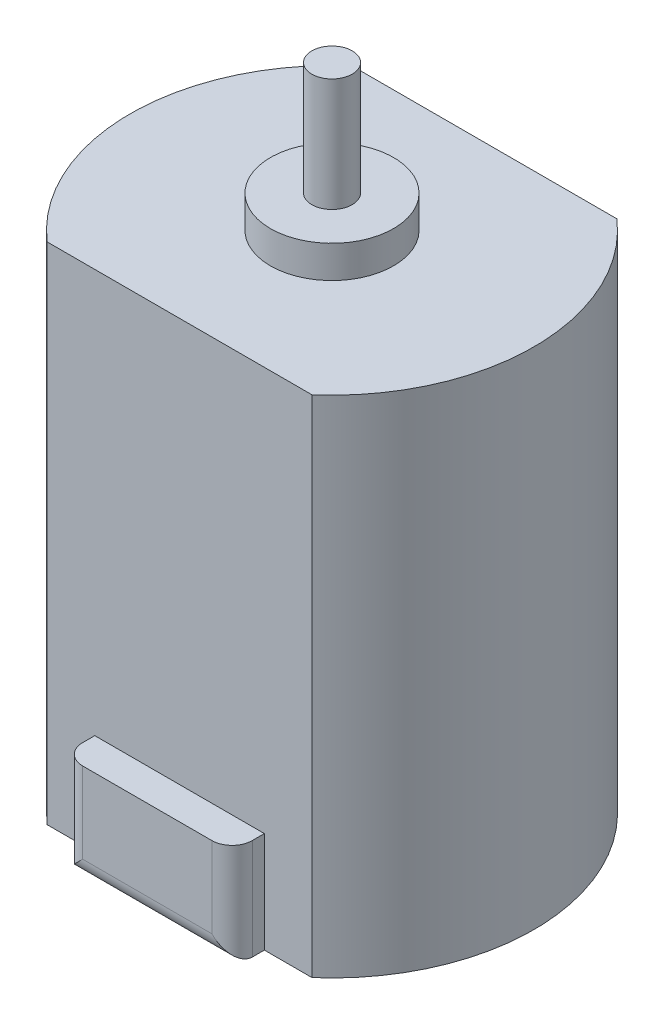
ISO-10303-21;
HEADER;
FILE_DESCRIPTION(('STEP AP214'),'2;1');
FILE_NAME('part.step','',(''),(''),'','','');
FILE_SCHEMA(('AUTOMOTIVE_DESIGN { 1 0 10303 214 1 1 1 1 }'));
ENDSEC;
DATA;
#1=APPLICATION_CONTEXT('core data for automotive mechanical design processes');
#2=APPLICATION_PROTOCOL_DEFINITION('international standard','automotive_design',2000,#1);
#3=PRODUCT_CONTEXT('',#1,'mechanical');
#4=PRODUCT('Part','Part','',(#3));
#5=PRODUCT_RELATED_PRODUCT_CATEGORY('part','',(#4));
#6=PRODUCT_DEFINITION_FORMATION('','',#4);
#7=PRODUCT_DEFINITION_CONTEXT('part definition',#1,'design');
#8=PRODUCT_DEFINITION('design','',#6,#7);
#9=PRODUCT_DEFINITION_SHAPE('','',#8);
#10=(LENGTH_UNIT() NAMED_UNIT(*) SI_UNIT(.MILLI.,.METRE.));
#11=(NAMED_UNIT(*) PLANE_ANGLE_UNIT() SI_UNIT($,.RADIAN.));
#12=(NAMED_UNIT(*) SI_UNIT($,.STERADIAN.) SOLID_ANGLE_UNIT());
#13=UNCERTAINTY_MEASURE_WITH_UNIT(LENGTH_MEASURE(1.E-05),#10,'distance_accuracy_value','');
#14=(GEOMETRIC_REPRESENTATION_CONTEXT(3) GLOBAL_UNCERTAINTY_ASSIGNED_CONTEXT((#13)) GLOBAL_UNIT_ASSIGNED_CONTEXT((#10,
#11,#12)) REPRESENTATION_CONTEXT('',''));
#15=CARTESIAN_POINT('',(0.,0.,0.));
#16=DIRECTION('',(0.,0.,1.));
#17=DIRECTION('',(1.,0.,0.));
#18=AXIS2_PLACEMENT_3D('',#15,#16,#17);
#19=CARTESIAN_POINT('',(0.,25.,7.55));
#20=DIRECTION('',(0.,0.,-1.));
#21=DIRECTION('',(-1.,0.,0.));
#22=AXIS2_PLACEMENT_3D('',#19,#20,#21);
#23=PLANE('',#22);
#24=DIRECTION('',(0.,-1.,0.));
#25=VECTOR('',#24,1.);
#26=CARTESIAN_POINT('',(-4.2,5.,7.55));
#27=LINE('',#26,#25);
#28=CARTESIAN_POINT('',(-4.2,5.,7.55));
#29=VERTEX_POINT('',#28);
#30=CARTESIAN_POINT('',(-4.2,0.,7.55));
#31=VERTEX_POINT('',#30);
#32=EDGE_CURVE('E133',#29,#31,#27,.T.);
#33=ORIENTED_EDGE('',*,*,#32,.F.);
#34=DIRECTION('',(-1.,0.,0.));
#35=VECTOR('',#34,1.);
#36=CARTESIAN_POINT('',(-4.2,5.,7.55));
#37=LINE('',#36,#35);
#38=CARTESIAN_POINT('',(4.2,5.,7.55));
#39=VERTEX_POINT('',#38);
#40=EDGE_CURVE('E121',#39,#29,#37,.T.);
#41=ORIENTED_EDGE('',*,*,#40,.F.);
#42=DIRECTION('',(0.,1.,0.));
#43=VECTOR('',#42,1.);
#44=CARTESIAN_POINT('',(4.2,5.,7.55));
#45=LINE('',#44,#43);
#46=CARTESIAN_POINT('',(4.2,0.,7.55));
#47=VERTEX_POINT('',#46);
#48=EDGE_CURVE('E129',#47,#39,#45,.T.);
#49=ORIENTED_EDGE('',*,*,#48,.F.);
#50=DIRECTION('',(1.,0.,0.));
#51=VECTOR('',#50,1.);
#52=CARTESIAN_POINT('',(0.,0.,7.55));
#53=LINE('',#52,#51);
#54=CARTESIAN_POINT('',(6.55724789831832,0.,7.55));
#55=VERTEX_POINT('',#54);
#56=EDGE_CURVE('E168',#47,#55,#53,.T.);
#57=ORIENTED_EDGE('',*,*,#56,.T.);
#58=DIRECTION('',(0.,-1.,0.));
#59=VECTOR('',#58,1.);
#60=CARTESIAN_POINT('',(6.55724789831832,25.,7.55));
#61=LINE('',#60,#59);
#62=CARTESIAN_POINT('',(6.55724789831832,25.,7.55));
#63=VERTEX_POINT('',#62);
#64=EDGE_CURVE('E171',#63,#55,#61,.T.);
#65=ORIENTED_EDGE('',*,*,#64,.F.);
#66=DIRECTION('',(1.,0.,0.));
#67=VECTOR('',#66,1.);
#68=CARTESIAN_POINT('',(0.,25.,7.55));
#69=LINE('',#68,#67);
#70=CARTESIAN_POINT('',(-6.55724789831832,25.,7.55));
#71=VERTEX_POINT('',#70);
#72=EDGE_CURVE('E172',#71,#63,#69,.T.);
#73=ORIENTED_EDGE('',*,*,#72,.F.);
#74=DIRECTION('',(0.,-1.,0.));
#75=VECTOR('',#74,1.);
#76=CARTESIAN_POINT('',(-6.55724789831832,25.,7.55));
#77=LINE('',#76,#75);
#78=CARTESIAN_POINT('',(-6.55724789831832,0.,7.55));
#79=VERTEX_POINT('',#78);
#80=EDGE_CURVE('E190',#71,#79,#77,.T.);
#81=ORIENTED_EDGE('',*,*,#80,.T.);
#82=EDGE_CURVE('E182',#79,#31,#53,.T.);
#83=ORIENTED_EDGE('',*,*,#82,.T.);
#84=EDGE_LOOP('',(#33,#41,#49,#57,#65,#73,#81,#83));
#85=FACE_BOUND('',#84,.T.);
#86=ADVANCED_FACE('F41',(#85),#23,.F.);
#87=CARTESIAN_POINT('',(0.,25.,0.));
#88=DIRECTION('',(0.,-1.,0.));
#89=DIRECTION('',(0.,0.,-1.));
#90=AXIS2_PLACEMENT_3D('',#87,#88,#89);
#91=CYLINDRICAL_SURFACE('',#90,10.);
#92=CARTESIAN_POINT('',(0.,0.,0.));
#93=DIRECTION('',(0.,1.,0.));
#94=DIRECTION('',(0.,0.,1.));
#95=AXIS2_PLACEMENT_3D('',#92,#93,#94);
#96=CIRCLE('',#95,10.);
#97=CARTESIAN_POINT('',(6.55724789831832,0.,-7.55));
#98=VERTEX_POINT('',#97);
#99=EDGE_CURVE('E184',#55,#98,#96,.T.);
#100=ORIENTED_EDGE('',*,*,#99,.T.);
#101=DIRECTION('',(0.,-1.,0.));
#102=VECTOR('',#101,1.);
#103=CARTESIAN_POINT('',(6.55724789831832,25.,-7.55));
#104=LINE('',#103,#102);
#105=CARTESIAN_POINT('',(6.55724789831832,25.,-7.55));
#106=VERTEX_POINT('',#105);
#107=EDGE_CURVE('E195',#106,#98,#104,.T.);
#108=ORIENTED_EDGE('',*,*,#107,.F.);
#109=CARTESIAN_POINT('',(0.,25.,0.));
#110=DIRECTION('',(0.,1.,0.));
#111=DIRECTION('',(0.,0.,1.));
#112=AXIS2_PLACEMENT_3D('',#109,#110,#111);
#113=CIRCLE('',#112,10.);
#114=EDGE_CURVE('E175',#63,#106,#113,.T.);
#115=ORIENTED_EDGE('',*,*,#114,.F.);
#116=ORIENTED_EDGE('',*,*,#64,.T.);
#117=EDGE_LOOP('',(#100,#108,#115,#116));
#118=FACE_BOUND('',#117,.T.);
#119=ADVANCED_FACE('F248',(#118),#91,.T.);
#120=CARTESIAN_POINT('',(0.,25.,-7.55));
#121=DIRECTION('',(0.,0.,-1.));
#122=DIRECTION('',(-1.,0.,0.));
#123=AXIS2_PLACEMENT_3D('',#120,#121,#122);
#124=PLANE('',#123);
#125=DIRECTION('',(1.,0.,0.));
#126=VECTOR('',#125,1.);
#127=CARTESIAN_POINT('',(0.,0.,-7.55));
#128=LINE('',#127,#126);
#129=CARTESIAN_POINT('',(-6.55724789831832,0.,-7.55));
#130=VERTEX_POINT('',#129);
#131=EDGE_CURVE('E187',#130,#98,#128,.T.);
#132=ORIENTED_EDGE('',*,*,#131,.F.);
#133=DIRECTION('',(0.,-1.,0.));
#134=VECTOR('',#133,1.);
#135=CARTESIAN_POINT('',(-6.55724789831832,25.,-7.55));
#136=LINE('',#135,#134);
#137=CARTESIAN_POINT('',(-6.55724789831832,25.,-7.55));
#138=VERTEX_POINT('',#137);
#139=EDGE_CURVE('E193',#138,#130,#136,.T.);
#140=ORIENTED_EDGE('',*,*,#139,.F.);
#141=DIRECTION('',(1.,0.,0.));
#142=VECTOR('',#141,1.);
#143=CARTESIAN_POINT('',(0.,25.,-7.55));
#144=LINE('',#143,#142);
#145=EDGE_CURVE('E178',#138,#106,#144,.T.);
#146=ORIENTED_EDGE('',*,*,#145,.T.);
#147=ORIENTED_EDGE('',*,*,#107,.T.);
#148=EDGE_LOOP('',(#132,#140,#146,#147));
#149=FACE_BOUND('',#148,.T.);
#150=ADVANCED_FACE('F245',(#149),#124,.T.);
#151=EDGE_CURVE('E176',#130,#79,#96,.T.);
#152=ORIENTED_EDGE('',*,*,#151,.T.);
#153=ORIENTED_EDGE('',*,*,#80,.F.);
#154=EDGE_CURVE('E179',#138,#71,#113,.T.);
#155=ORIENTED_EDGE('',*,*,#154,.F.);
#156=ORIENTED_EDGE('',*,*,#139,.T.);
#157=EDGE_LOOP('',(#152,#153,#155,#156));
#158=FACE_BOUND('',#157,.T.);
#159=ADVANCED_FACE('F240',(#158),#91,.T.);
#160=CARTESIAN_POINT('',(0.,25.,0.));
#161=DIRECTION('',(0.,1.,0.));
#162=DIRECTION('',(0.,0.,1.));
#163=AXIS2_PLACEMENT_3D('',#160,#161,#162);
#164=PLANE('',#163);
#165=CARTESIAN_POINT('',(0.,25.,0.));
#166=DIRECTION('',(0.,1.,0.));
#167=DIRECTION('',(0.,0.,1.));
#168=AXIS2_PLACEMENT_3D('',#165,#166,#167);
#169=CIRCLE('',#168,3.05);
#170=CARTESIAN_POINT('',(0.,25.,3.05));
#171=VERTEX_POINT('',#170);
#172=EDGE_CURVE('E165',#171,#171,#169,.T.);
#173=ORIENTED_EDGE('',*,*,#172,.F.);
#174=EDGE_LOOP('',(#173));
#175=FACE_BOUND('',#174,.T.);
#176=ORIENTED_EDGE('',*,*,#72,.T.);
#177=ORIENTED_EDGE('',*,*,#114,.T.);
#178=ORIENTED_EDGE('',*,*,#145,.F.);
#179=ORIENTED_EDGE('',*,*,#154,.T.);
#180=EDGE_LOOP('',(#176,#177,#178,#179));
#181=FACE_BOUND('',#180,.T.);
#182=ADVANCED_FACE('F250',(#175,#181),#164,.T.);
#183=CARTESIAN_POINT('',(0.,0.,0.));
#184=DIRECTION('',(0.,1.,0.));
#185=DIRECTION('',(0.,0.,1.));
#186=AXIS2_PLACEMENT_3D('',#183,#184,#185);
#187=PLANE('',#186);
#188=CARTESIAN_POINT('',(0.,0.,0.));
#189=DIRECTION('',(0.,-1.,0.));
#190=DIRECTION('',(0.,0.,-1.));
#191=AXIS2_PLACEMENT_3D('',#188,#189,#190);
#192=CIRCLE('',#191,4.95);
#193=CARTESIAN_POINT('',(0.,0.,-4.95));
#194=VERTEX_POINT('',#193);
#195=EDGE_CURVE('E153',#194,#194,#192,.T.);
#196=ORIENTED_EDGE('',*,*,#195,.F.);
#197=EDGE_LOOP('',(#196));
#198=FACE_BOUND('',#197,.T.);
#199=DIRECTION('',(0.,0.,-1.));
#200=VECTOR('',#199,1.);
#201=CARTESIAN_POINT('',(4.2,0.,9.15));
#202=LINE('',#201,#200);
#203=CARTESIAN_POINT('',(4.2,0.,8.15));
#204=VERTEX_POINT('',#203);
#205=EDGE_CURVE('E123',#204,#47,#202,.T.);
#206=ORIENTED_EDGE('',*,*,#205,.F.);
#207=DIRECTION('',(1.,0.,0.));
#208=VECTOR('',#207,1.);
#209=CARTESIAN_POINT('',(-4.2,0.,8.15));
#210=LINE('',#209,#208);
#211=CARTESIAN_POINT('',(-4.2,0.,8.15));
#212=VERTEX_POINT('',#211);
#213=EDGE_CURVE('E11',#204,#212,#210,.F.);
#214=ORIENTED_EDGE('',*,*,#213,.T.);
#215=DIRECTION('',(0.,0.,-1.));
#216=VECTOR('',#215,1.);
#217=CARTESIAN_POINT('',(-4.2,0.,9.15));
#218=LINE('',#217,#216);
#219=EDGE_CURVE('E143',#212,#31,#218,.T.);
#220=ORIENTED_EDGE('',*,*,#219,.T.);
#221=ORIENTED_EDGE('',*,*,#82,.F.);
#222=ORIENTED_EDGE('',*,*,#151,.F.);
#223=ORIENTED_EDGE('',*,*,#131,.T.);
#224=ORIENTED_EDGE('',*,*,#99,.F.);
#225=ORIENTED_EDGE('',*,*,#56,.F.);
#226=EDGE_LOOP('',(#206,#214,#220,#221,#222,#223,#224,#225));
#227=FACE_BOUND('',#226,.T.);
#228=ADVANCED_FACE('F233',(#198,#227),#187,.F.);
#229=CARTESIAN_POINT('',(0.,26.6,0.));
#230=DIRECTION('',(0.,-1.,0.));
#231=DIRECTION('',(0.,0.,-1.));
#232=AXIS2_PLACEMENT_3D('',#229,#230,#231);
#233=CYLINDRICAL_SURFACE('',#232,3.05);
#234=CARTESIAN_POINT('',(0.,26.6,0.));
#235=DIRECTION('',(0.,1.,0.));
#236=DIRECTION('',(0.,0.,1.));
#237=AXIS2_PLACEMENT_3D('',#234,#235,#236);
#238=CIRCLE('',#237,3.05);
#239=CARTESIAN_POINT('',(0.,26.6,3.05));
#240=VERTEX_POINT('',#239);
#241=EDGE_CURVE('E162',#240,#240,#238,.T.);
#242=ORIENTED_EDGE('',*,*,#241,.F.);
#243=EDGE_LOOP('',(#242));
#244=FACE_BOUND('',#243,.T.);
#245=ORIENTED_EDGE('',*,*,#172,.T.);
#246=EDGE_LOOP('',(#245));
#247=FACE_BOUND('',#246,.T.);
#248=ADVANCED_FACE('F258',(#244,#247),#233,.T.);
#249=CARTESIAN_POINT('',(0.,26.6,0.));
#250=DIRECTION('',(0.,1.,0.));
#251=DIRECTION('',(0.,0.,1.));
#252=AXIS2_PLACEMENT_3D('',#249,#250,#251);
#253=PLANE('',#252);
#254=CARTESIAN_POINT('',(0.,26.6,0.));
#255=DIRECTION('',(0.,1.,0.));
#256=DIRECTION('',(0.,0.,1.));
#257=AXIS2_PLACEMENT_3D('',#254,#255,#256);
#258=CIRCLE('',#257,1.);
#259=CARTESIAN_POINT('',(0.,26.6,1.));
#260=VERTEX_POINT('',#259);
#261=EDGE_CURVE('E159',#260,#260,#258,.T.);
#262=ORIENTED_EDGE('',*,*,#261,.F.);
#263=EDGE_LOOP('',(#262));
#264=FACE_BOUND('',#263,.T.);
#265=ORIENTED_EDGE('',*,*,#241,.T.);
#266=EDGE_LOOP('',(#265));
#267=FACE_BOUND('',#266,.T.);
#268=ADVANCED_FACE('F312',(#264,#267),#253,.T.);
#269=CARTESIAN_POINT('',(0.,32.2,0.));
#270=DIRECTION('',(0.,-1.,0.));
#271=DIRECTION('',(0.,0.,-1.));
#272=AXIS2_PLACEMENT_3D('',#269,#270,#271);
#273=CYLINDRICAL_SURFACE('',#272,1.);
#274=CARTESIAN_POINT('',(0.,32.2,0.));
#275=DIRECTION('',(0.,1.,0.));
#276=DIRECTION('',(0.,0.,1.));
#277=AXIS2_PLACEMENT_3D('',#274,#275,#276);
#278=CIRCLE('',#277,1.);
#279=CARTESIAN_POINT('',(0.,32.2,1.));
#280=VERTEX_POINT('',#279);
#281=EDGE_CURVE('E156',#280,#280,#278,.T.);
#282=ORIENTED_EDGE('',*,*,#281,.F.);
#283=EDGE_LOOP('',(#282));
#284=FACE_BOUND('',#283,.T.);
#285=ORIENTED_EDGE('',*,*,#261,.T.);
#286=EDGE_LOOP('',(#285));
#287=FACE_BOUND('',#286,.T.);
#288=ADVANCED_FACE('F308',(#284,#287),#273,.T.);
#289=CARTESIAN_POINT('',(0.,32.2,0.));
#290=DIRECTION('',(0.,1.,0.));
#291=DIRECTION('',(0.,0.,1.));
#292=AXIS2_PLACEMENT_3D('',#289,#290,#291);
#293=PLANE('',#292);
#294=ORIENTED_EDGE('',*,*,#281,.T.);
#295=EDGE_LOOP('',(#294));
#296=FACE_BOUND('',#295,.T.);
#297=ADVANCED_FACE('F304',(#296),#293,.T.);
#298=CARTESIAN_POINT('',(0.,-2.3,0.));
#299=DIRECTION('',(0.,1.,0.));
#300=DIRECTION('',(0.,0.,1.));
#301=AXIS2_PLACEMENT_3D('',#298,#299,#300);
#302=CYLINDRICAL_SURFACE('',#301,4.95);
#303=CARTESIAN_POINT('',(0.,-2.3,0.));
#304=DIRECTION('',(0.,-1.,0.));
#305=DIRECTION('',(0.,0.,-1.));
#306=AXIS2_PLACEMENT_3D('',#303,#304,#305);
#307=CIRCLE('',#306,4.95);
#308=CARTESIAN_POINT('',(0.,-2.3,-4.95));
#309=VERTEX_POINT('',#308);
#310=EDGE_CURVE('E148',#309,#309,#307,.T.);
#311=ORIENTED_EDGE('',*,*,#310,.F.);
#312=EDGE_LOOP('',(#311));
#313=FACE_BOUND('',#312,.T.);
#314=ORIENTED_EDGE('',*,*,#195,.T.);
#315=EDGE_LOOP('',(#314));
#316=FACE_BOUND('',#315,.T.);
#317=ADVANCED_FACE('F300',(#313,#316),#302,.T.);
#318=CARTESIAN_POINT('',(0.,-2.3,0.));
#319=DIRECTION('',(0.,-1.,0.));
#320=DIRECTION('',(0.,0.,-1.));
#321=AXIS2_PLACEMENT_3D('',#318,#319,#320);
#322=PLANE('',#321);
#323=CARTESIAN_POINT('',(0.,-2.3,0.));
#324=DIRECTION('',(0.,-1.,0.));
#325=DIRECTION('',(0.,0.,-1.));
#326=AXIS2_PLACEMENT_3D('',#323,#324,#325);
#327=CIRCLE('',#326,1.);
#328=CARTESIAN_POINT('',(0.,-2.3,-1.));
#329=VERTEX_POINT('',#328);
#330=EDGE_CURVE('E149',#329,#329,#327,.T.);
#331=ORIENTED_EDGE('',*,*,#330,.F.);
#332=EDGE_LOOP('',(#331));
#333=FACE_BOUND('',#332,.T.);
#334=ORIENTED_EDGE('',*,*,#310,.T.);
#335=EDGE_LOOP('',(#334));
#336=FACE_BOUND('',#335,.T.);
#337=ADVANCED_FACE('F296',(#333,#336),#322,.T.);
#338=CARTESIAN_POINT('',(0.,-3.8,0.));
#339=DIRECTION('',(0.,1.,0.));
#340=DIRECTION('',(0.,0.,1.));
#341=AXIS2_PLACEMENT_3D('',#338,#339,#340);
#342=CYLINDRICAL_SURFACE('',#341,1.);
#343=CARTESIAN_POINT('',(0.,-3.8,0.));
#344=DIRECTION('',(0.,-1.,0.));
#345=DIRECTION('',(0.,0.,-1.));
#346=AXIS2_PLACEMENT_3D('',#343,#344,#345);
#347=CIRCLE('',#346,1.);
#348=CARTESIAN_POINT('',(0.,-3.8,-1.));
#349=VERTEX_POINT('',#348);
#350=EDGE_CURVE('E145',#349,#349,#347,.T.);
#351=ORIENTED_EDGE('',*,*,#350,.F.);
#352=EDGE_LOOP('',(#351));
#353=FACE_BOUND('',#352,.T.);
#354=ORIENTED_EDGE('',*,*,#330,.T.);
#355=EDGE_LOOP('',(#354));
#356=FACE_BOUND('',#355,.T.);
#357=ADVANCED_FACE('F292',(#353,#356),#342,.T.);
#358=CARTESIAN_POINT('',(0.,-3.8,0.));
#359=DIRECTION('',(0.,-1.,0.));
#360=DIRECTION('',(0.,0.,-1.));
#361=AXIS2_PLACEMENT_3D('',#358,#359,#360);
#362=PLANE('',#361);
#363=ORIENTED_EDGE('',*,*,#350,.T.);
#364=EDGE_LOOP('',(#363));
#365=FACE_BOUND('',#364,.T.);
#366=ADVANCED_FACE('F289',(#365),#362,.T.);
#367=CARTESIAN_POINT('',(-4.2,5.,9.15));
#368=DIRECTION('',(1.,0.,0.));
#369=DIRECTION('',(0.,0.,-1.));
#370=AXIS2_PLACEMENT_3D('',#367,#368,#369);
#371=PLANE('',#370);
#372=ORIENTED_EDGE('',*,*,#219,.F.);
#373=DIRECTION('',(0.,-1.,0.));
#374=VECTOR('',#373,1.);
#375=CARTESIAN_POINT('',(-4.2,5.,8.15));
#376=LINE('',#375,#374);
#377=CARTESIAN_POINT('',(-4.2,5.,8.15));
#378=VERTEX_POINT('',#377);
#379=EDGE_CURVE('E205',#212,#378,#376,.F.);
#380=ORIENTED_EDGE('',*,*,#379,.T.);
#381=DIRECTION('',(0.,0.,-1.));
#382=VECTOR('',#381,1.);
#383=CARTESIAN_POINT('',(-4.2,5.,9.15));
#384=LINE('',#383,#382);
#385=EDGE_CURVE('E124',#378,#29,#384,.T.);
#386=ORIENTED_EDGE('',*,*,#385,.T.);
#387=ORIENTED_EDGE('',*,*,#32,.T.);
#388=EDGE_LOOP('',(#372,#380,#386,#387));
#389=FACE_BOUND('',#388,.T.);
#390=ADVANCED_FACE('F230',(#389),#371,.F.);
#391=CARTESIAN_POINT('',(4.2,5.,9.15));
#392=DIRECTION('',(-1.,0.,0.));
#393=DIRECTION('',(0.,0.,1.));
#394=AXIS2_PLACEMENT_3D('',#391,#392,#393);
#395=PLANE('',#394);
#396=DIRECTION('',(0.,0.,-1.));
#397=VECTOR('',#396,1.);
#398=CARTESIAN_POINT('',(4.2,5.,9.15));
#399=LINE('',#398,#397);
#400=CARTESIAN_POINT('',(4.2,5.,8.15));
#401=VERTEX_POINT('',#400);
#402=EDGE_CURVE('E117',#401,#39,#399,.T.);
#403=ORIENTED_EDGE('',*,*,#402,.F.);
#404=DIRECTION('',(0.,1.,0.));
#405=VECTOR('',#404,1.);
#406=CARTESIAN_POINT('',(4.2,0.,8.15));
#407=LINE('',#406,#405);
#408=EDGE_CURVE('E50',#401,#204,#407,.F.);
#409=ORIENTED_EDGE('',*,*,#408,.T.);
#410=ORIENTED_EDGE('',*,*,#205,.T.);
#411=ORIENTED_EDGE('',*,*,#48,.T.);
#412=EDGE_LOOP('',(#403,#409,#410,#411));
#413=FACE_BOUND('',#412,.T.);
#414=ADVANCED_FACE('F136',(#413),#395,.F.);
#415=CARTESIAN_POINT('',(-4.2,5.,9.15));
#416=DIRECTION('',(0.,-1.,0.));
#417=DIRECTION('',(1.,0.,0.));
#418=AXIS2_PLACEMENT_3D('',#415,#416,#417);
#419=PLANE('',#418);
#420=ORIENTED_EDGE('',*,*,#385,.F.);
#421=CARTESIAN_POINT('',(-3.2,5.,8.15));
#422=DIRECTION('',(0.,-1.,0.));
#423=DIRECTION('',(1.,0.,0.));
#424=AXIS2_PLACEMENT_3D('',#421,#422,#423);
#425=CIRCLE('',#424,1.);
#426=CARTESIAN_POINT('',(-3.2,5.,9.15));
#427=VERTEX_POINT('',#426);
#428=EDGE_CURVE('E208',#378,#427,#425,.F.);
#429=ORIENTED_EDGE('',*,*,#428,.T.);
#430=DIRECTION('',(-1.,0.,0.));
#431=VECTOR('',#430,1.);
#432=CARTESIAN_POINT('',(-4.2,5.,9.15));
#433=LINE('',#432,#431);
#434=CARTESIAN_POINT('',(3.2,5.,9.15));
#435=VERTEX_POINT('',#434);
#436=EDGE_CURVE('E134',#435,#427,#433,.T.);
#437=ORIENTED_EDGE('',*,*,#436,.F.);
#438=CARTESIAN_POINT('',(3.2,5.,8.15));
#439=DIRECTION('',(0.,-1.,0.));
#440=DIRECTION('',(1.,0.,0.));
#441=AXIS2_PLACEMENT_3D('',#438,#439,#440);
#442=CIRCLE('',#441,1.);
#443=EDGE_CURVE('E65',#435,#401,#442,.F.);
#444=ORIENTED_EDGE('',*,*,#443,.T.);
#445=ORIENTED_EDGE('',*,*,#402,.T.);
#446=ORIENTED_EDGE('',*,*,#40,.T.);
#447=EDGE_LOOP('',(#420,#429,#437,#444,#445,#446));
#448=FACE_BOUND('',#447,.T.);
#449=ADVANCED_FACE('F120',(#448),#419,.F.);
#450=CARTESIAN_POINT('',(0.,0.,9.15));
#451=DIRECTION('',(0.,0.,1.));
#452=DIRECTION('',(1.,0.,0.));
#453=AXIS2_PLACEMENT_3D('',#450,#451,#452);
#454=PLANE('',#453);
#455=ORIENTED_EDGE('',*,*,#436,.T.);
#456=DIRECTION('',(0.,-1.,0.));
#457=VECTOR('',#456,1.);
#458=CARTESIAN_POINT('',(-3.2,0.,9.15));
#459=LINE('',#458,#457);
#460=CARTESIAN_POINT('',(-3.2,1.,9.15));
#461=VERTEX_POINT('',#460);
#462=EDGE_CURVE('E202',#427,#461,#459,.T.);
#463=ORIENTED_EDGE('',*,*,#462,.T.);
#464=DIRECTION('',(1.,0.,0.));
#465=VECTOR('',#464,1.);
#466=CARTESIAN_POINT('',(4.2,1.,9.15));
#467=LINE('',#466,#465);
#468=CARTESIAN_POINT('',(3.2,1.,9.15));
#469=VERTEX_POINT('',#468);
#470=EDGE_CURVE('E152',#461,#469,#467,.T.);
#471=ORIENTED_EDGE('',*,*,#470,.T.);
#472=DIRECTION('',(0.,1.,0.));
#473=VECTOR('',#472,1.);
#474=CARTESIAN_POINT('',(3.2,5.,9.15));
#475=LINE('',#474,#473);
#476=EDGE_CURVE('E200',#469,#435,#475,.T.);
#477=ORIENTED_EDGE('',*,*,#476,.T.);
#478=EDGE_LOOP('',(#455,#463,#471,#477));
#479=FACE_BOUND('',#478,.T.);
#480=ADVANCED_FACE('F225',(#479),#454,.T.);
#481=CARTESIAN_POINT('',(3.2,0.,8.15));
#482=DIRECTION('',(0.,-1.,0.));
#483=DIRECTION('',(0.,0.,-1.));
#484=AXIS2_PLACEMENT_3D('',#481,#482,#483);
#485=CYLINDRICAL_SURFACE('',#484,1.);
#486=ORIENTED_EDGE('',*,*,#443,.F.);
#487=ORIENTED_EDGE('',*,*,#476,.F.);
#488=CARTESIAN_POINT('',(3.2,1.,8.15));
#489=DIRECTION('',(-0.707106781186547,-0.707106781186547,0.));
#490=DIRECTION('',(-0.707106781186547,0.707106781186547,0.));
#491=AXIS2_PLACEMENT_3D('',#488,#489,#490);
#492=ELLIPSE('',#491,1.41421356237309,1.);
#493=EDGE_CURVE('E45',#204,#469,#492,.T.);
#494=ORIENTED_EDGE('',*,*,#493,.F.);
#495=ORIENTED_EDGE('',*,*,#408,.F.);
#496=EDGE_LOOP('',(#486,#487,#494,#495));
#497=FACE_BOUND('',#496,.T.);
#498=ADVANCED_FACE('F43',(#497),#485,.T.);
#499=CARTESIAN_POINT('',(0.,1.,8.15));
#500=DIRECTION('',(-1.,0.,0.));
#501=DIRECTION('',(0.,0.,1.));
#502=AXIS2_PLACEMENT_3D('',#499,#500,#501);
#503=CYLINDRICAL_SURFACE('',#502,1.);
#504=ORIENTED_EDGE('',*,*,#493,.T.);
#505=ORIENTED_EDGE('',*,*,#470,.F.);
#506=CARTESIAN_POINT('',(-3.2,1.,8.15));
#507=DIRECTION('',(-0.707106781186547,0.707106781186547,0.));
#508=DIRECTION('',(-0.707106781186547,-0.707106781186547,0.));
#509=AXIS2_PLACEMENT_3D('',#506,#507,#508);
#510=ELLIPSE('',#509,1.41421356237309,1.);
#511=EDGE_CURVE('E210',#212,#461,#510,.T.);
#512=ORIENTED_EDGE('',*,*,#511,.F.);
#513=ORIENTED_EDGE('',*,*,#213,.F.);
#514=EDGE_LOOP('',(#504,#505,#512,#513));
#515=FACE_BOUND('',#514,.T.);
#516=ADVANCED_FACE('F220',(#515),#503,.T.);
#517=CARTESIAN_POINT('',(-3.2,0.,8.15));
#518=DIRECTION('',(0.,1.,0.));
#519=DIRECTION('',(0.,0.,1.));
#520=AXIS2_PLACEMENT_3D('',#517,#518,#519);
#521=CYLINDRICAL_SURFACE('',#520,1.);
#522=ORIENTED_EDGE('',*,*,#428,.F.);
#523=ORIENTED_EDGE('',*,*,#379,.F.);
#524=ORIENTED_EDGE('',*,*,#511,.T.);
#525=ORIENTED_EDGE('',*,*,#462,.F.);
#526=EDGE_LOOP('',(#522,#523,#524,#525));
#527=FACE_BOUND('',#526,.T.);
#528=ADVANCED_FACE('F227',(#527),#521,.T.);
#529=CLOSED_SHELL('',(#86,#119,#150,#159,#182,#228,#248,#268,#288,#297,#317,#337,#357,#366,#390,
#414,#449,#480,#498,#516,#528));
#530=MANIFOLD_SOLID_BREP('B2',#529);
#531=ADVANCED_BREP_SHAPE_REPRESENTATION('',(#18,#530),#14);
#532=SHAPE_DEFINITION_REPRESENTATION(#9,#531);
ENDSEC;
END-ISO-10303-21;
